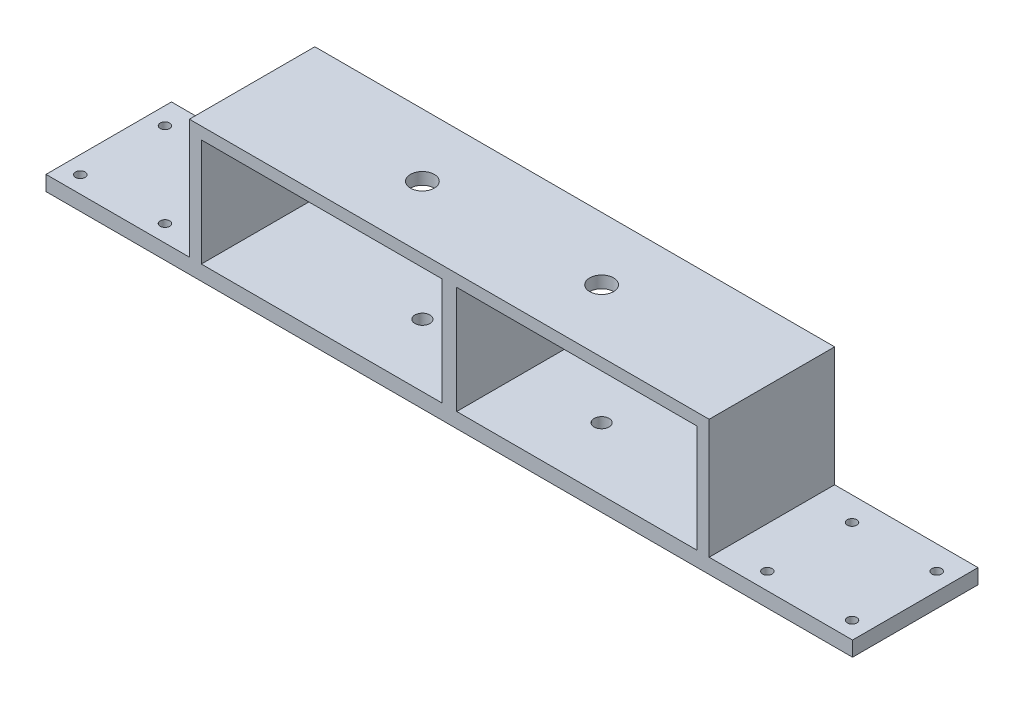
ISO-10303-21;
HEADER;
FILE_DESCRIPTION(('STEP AP214'),'2;1');
FILE_NAME('part.step','',(''),(''),'','','');
FILE_SCHEMA(('AUTOMOTIVE_DESIGN { 1 0 10303 214 1 1 1 1 }'));
ENDSEC;
DATA;
#1=APPLICATION_CONTEXT('core data for automotive mechanical design processes');
#2=APPLICATION_PROTOCOL_DEFINITION('international standard','automotive_design',2000,#1);
#3=PRODUCT_CONTEXT('',#1,'mechanical');
#4=PRODUCT('Part','Part','',(#3));
#5=PRODUCT_RELATED_PRODUCT_CATEGORY('part','',(#4));
#6=PRODUCT_DEFINITION_FORMATION('','',#4);
#7=PRODUCT_DEFINITION_CONTEXT('part definition',#1,'design');
#8=PRODUCT_DEFINITION('design','',#6,#7);
#9=PRODUCT_DEFINITION_SHAPE('','',#8);
#10=(LENGTH_UNIT() NAMED_UNIT(*) SI_UNIT(.MILLI.,.METRE.));
#11=(NAMED_UNIT(*) PLANE_ANGLE_UNIT() SI_UNIT($,.RADIAN.));
#12=(NAMED_UNIT(*) SI_UNIT($,.STERADIAN.) SOLID_ANGLE_UNIT());
#13=UNCERTAINTY_MEASURE_WITH_UNIT(LENGTH_MEASURE(1.E-05),#10,'distance_accuracy_value','');
#14=(GEOMETRIC_REPRESENTATION_CONTEXT(3) GLOBAL_UNCERTAINTY_ASSIGNED_CONTEXT((#13)) GLOBAL_UNIT_ASSIGNED_CONTEXT((#10,
#11,#12)) REPRESENTATION_CONTEXT('',''));
#15=CARTESIAN_POINT('',(0.,0.,0.));
#16=DIRECTION('',(0.,0.,1.));
#17=DIRECTION('',(1.,0.,0.));
#18=AXIS2_PLACEMENT_3D('',#15,#16,#17);
#19=CARTESIAN_POINT('',(0.,3.175,0.));
#20=DIRECTION('',(0.,1.,0.));
#21=DIRECTION('',(0.,0.,1.));
#22=AXIS2_PLACEMENT_3D('',#19,#20,#21);
#23=PLANE('',#22);
#24=CARTESIAN_POINT('',(-19.05,3.175,-13.335));
#25=DIRECTION('',(0.,1.,0.));
#26=DIRECTION('',(0.,0.,1.));
#27=AXIS2_PLACEMENT_3D('',#24,#25,#26);
#28=CIRCLE('',#27,1.5875);
#29=CARTESIAN_POINT('',(-19.05,3.175,-11.7475));
#30=VERTEX_POINT('',#29);
#31=EDGE_CURVE('E201',#30,#30,#28,.T.);
#32=ORIENTED_EDGE('',*,*,#31,.F.);
#33=EDGE_LOOP('',(#32));
#34=FACE_BOUND('',#33,.T.);
#35=DIRECTION('',(1.,0.,0.));
#36=VECTOR('',#35,1.);
#37=CARTESIAN_POINT('',(85.725,3.175,0.));
#38=LINE('',#37,#36);
#39=CARTESIAN_POINT('',(-52.705,3.175,0.));
#40=VERTEX_POINT('',#39);
#41=CARTESIAN_POINT('',(-1.58750000000001,3.175,0.));
#42=VERTEX_POINT('',#41);
#43=EDGE_CURVE('E62',#40,#42,#38,.T.);
#44=ORIENTED_EDGE('',*,*,#43,.T.);
#45=DIRECTION('',(0.,0.,1.));
#46=VECTOR('',#45,1.);
#47=CARTESIAN_POINT('',(-1.5875,3.175,0.));
#48=LINE('',#47,#46);
#49=CARTESIAN_POINT('',(-1.5875,3.175,-26.67));
#50=VERTEX_POINT('',#49);
#51=EDGE_CURVE('E166',#50,#42,#48,.T.);
#52=ORIENTED_EDGE('',*,*,#51,.F.);
#53=DIRECTION('',(-1.,0.,0.));
#54=VECTOR('',#53,1.);
#55=CARTESIAN_POINT('',(85.725,3.175,-26.67));
#56=LINE('',#55,#54);
#57=CARTESIAN_POINT('',(-52.705,3.175,-26.67));
#58=VERTEX_POINT('',#57);
#59=EDGE_CURVE('E152',#50,#58,#56,.T.);
#60=ORIENTED_EDGE('',*,*,#59,.T.);
#61=DIRECTION('',(0.,0.,-1.));
#62=VECTOR('',#61,1.);
#63=CARTESIAN_POINT('',(-52.705,3.175,0.));
#64=LINE('',#63,#62);
#65=EDGE_CURVE('E247',#40,#58,#64,.T.);
#66=ORIENTED_EDGE('',*,*,#65,.F.);
#67=EDGE_LOOP('',(#44,#52,#60,#66));
#68=FACE_BOUND('',#67,.T.);
#69=ADVANCED_FACE('F39',(#34,#68),#23,.T.);
#70=CARTESIAN_POINT('',(19.05,3.175,-13.335));
#71=DIRECTION('',(0.,1.,0.));
#72=DIRECTION('',(0.,0.,1.));
#73=AXIS2_PLACEMENT_3D('',#70,#71,#72);
#74=CIRCLE('',#73,1.5875);
#75=CARTESIAN_POINT('',(19.05,3.175,-11.7475));
#76=VERTEX_POINT('',#75);
#77=EDGE_CURVE('E195',#76,#76,#74,.T.);
#78=ORIENTED_EDGE('',*,*,#77,.F.);
#79=EDGE_LOOP('',(#78));
#80=FACE_BOUND('',#79,.T.);
#81=CARTESIAN_POINT('',(52.705,3.175,-26.67));
#82=VERTEX_POINT('',#81);
#83=CARTESIAN_POINT('',(1.58750000000001,3.175,-26.67));
#84=VERTEX_POINT('',#83);
#85=EDGE_CURVE('E161',#82,#84,#56,.T.);
#86=ORIENTED_EDGE('',*,*,#85,.T.);
#87=DIRECTION('',(0.,0.,-1.));
#88=VECTOR('',#87,1.);
#89=CARTESIAN_POINT('',(1.5875,3.175,0.));
#90=LINE('',#89,#88);
#91=CARTESIAN_POINT('',(1.58750000000001,3.175,0.));
#92=VERTEX_POINT('',#91);
#93=EDGE_CURVE('E54',#92,#84,#90,.T.);
#94=ORIENTED_EDGE('',*,*,#93,.F.);
#95=CARTESIAN_POINT('',(52.705,3.175,0.));
#96=VERTEX_POINT('',#95);
#97=EDGE_CURVE('E322',#92,#96,#38,.T.);
#98=ORIENTED_EDGE('',*,*,#97,.T.);
#99=DIRECTION('',(0.,0.,-1.));
#100=VECTOR('',#99,1.);
#101=CARTESIAN_POINT('',(52.705,3.175,0.));
#102=LINE('',#101,#100);
#103=EDGE_CURVE('E227',#96,#82,#102,.T.);
#104=ORIENTED_EDGE('',*,*,#103,.T.);
#105=EDGE_LOOP('',(#86,#94,#98,#104));
#106=FACE_BOUND('',#105,.T.);
#107=ADVANCED_FACE('F360',(#80,#106),#23,.T.);
#108=CARTESIAN_POINT('',(82.0356793493558,26.035,0.));
#109=DIRECTION('',(0.,-1.,0.));
#110=DIRECTION('',(0.,0.,-1.));
#111=AXIS2_PLACEMENT_3D('',#108,#109,#110);
#112=PLANE('',#111);
#113=CARTESIAN_POINT('',(-19.05,26.035,-13.335));
#114=DIRECTION('',(0.,-1.,0.));
#115=DIRECTION('',(0.,0.,-1.));
#116=AXIS2_PLACEMENT_3D('',#113,#114,#115);
#117=CIRCLE('',#116,2.54);
#118=CARTESIAN_POINT('',(-19.05,26.035,-15.875));
#119=VERTEX_POINT('',#118);
#120=EDGE_CURVE('E192',#119,#119,#117,.F.);
#121=ORIENTED_EDGE('',*,*,#120,.T.);
#122=EDGE_LOOP('',(#121));
#123=FACE_BOUND('',#122,.T.);
#124=DIRECTION('',(-1.,0.,0.));
#125=VECTOR('',#124,1.);
#126=CARTESIAN_POINT('',(82.0356793493558,26.035,-26.67));
#127=LINE('',#126,#125);
#128=CARTESIAN_POINT('',(-1.5875,26.035,-26.67));
#129=VERTEX_POINT('',#128);
#130=CARTESIAN_POINT('',(-52.705,26.035,-26.67));
#131=VERTEX_POINT('',#130);
#132=EDGE_CURVE('E222',#129,#131,#127,.T.);
#133=ORIENTED_EDGE('',*,*,#132,.F.);
#134=DIRECTION('',(0.,0.,-1.));
#135=VECTOR('',#134,1.);
#136=CARTESIAN_POINT('',(-1.5875,26.035,0.));
#137=LINE('',#136,#135);
#138=CARTESIAN_POINT('',(-1.5875,26.035,0.));
#139=VERTEX_POINT('',#138);
#140=EDGE_CURVE('E172',#139,#129,#137,.T.);
#141=ORIENTED_EDGE('',*,*,#140,.F.);
#142=DIRECTION('',(-1.,0.,0.));
#143=VECTOR('',#142,1.);
#144=CARTESIAN_POINT('',(82.0356793493558,26.035,0.));
#145=LINE('',#144,#143);
#146=CARTESIAN_POINT('',(-52.705,26.035,0.));
#147=VERTEX_POINT('',#146);
#148=EDGE_CURVE('E218',#139,#147,#145,.T.);
#149=ORIENTED_EDGE('',*,*,#148,.T.);
#150=DIRECTION('',(0.,0.,-1.));
#151=VECTOR('',#150,1.);
#152=CARTESIAN_POINT('',(-52.705,26.035,0.));
#153=LINE('',#152,#151);
#154=EDGE_CURVE('E248',#147,#131,#153,.T.);
#155=ORIENTED_EDGE('',*,*,#154,.T.);
#156=EDGE_LOOP('',(#133,#141,#149,#155));
#157=FACE_BOUND('',#156,.T.);
#158=ADVANCED_FACE('F400',(#123,#157),#112,.T.);
#159=CARTESIAN_POINT('',(19.05,26.035,-13.335));
#160=DIRECTION('',(0.,-1.,0.));
#161=DIRECTION('',(0.,0.,-1.));
#162=AXIS2_PLACEMENT_3D('',#159,#160,#161);
#163=CIRCLE('',#162,2.54);
#164=CARTESIAN_POINT('',(19.05,26.035,-15.875));
#165=VERTEX_POINT('',#164);
#166=EDGE_CURVE('E185',#165,#165,#163,.F.);
#167=ORIENTED_EDGE('',*,*,#166,.T.);
#168=EDGE_LOOP('',(#167));
#169=FACE_BOUND('',#168,.T.);
#170=CARTESIAN_POINT('',(52.705,26.035,0.));
#171=VERTEX_POINT('',#170);
#172=CARTESIAN_POINT('',(1.5875,26.035,0.));
#173=VERTEX_POINT('',#172);
#174=EDGE_CURVE('E214',#171,#173,#145,.T.);
#175=ORIENTED_EDGE('',*,*,#174,.T.);
#176=DIRECTION('',(0.,0.,1.));
#177=VECTOR('',#176,1.);
#178=CARTESIAN_POINT('',(1.5875,26.035,0.));
#179=LINE('',#178,#177);
#180=CARTESIAN_POINT('',(1.58750000000001,26.035,-26.67));
#181=VERTEX_POINT('',#180);
#182=EDGE_CURVE('E186',#181,#173,#179,.T.);
#183=ORIENTED_EDGE('',*,*,#182,.F.);
#184=CARTESIAN_POINT('',(52.705,26.035,-26.67));
#185=VERTEX_POINT('',#184);
#186=EDGE_CURVE('E219',#185,#181,#127,.T.);
#187=ORIENTED_EDGE('',*,*,#186,.F.);
#188=DIRECTION('',(0.,0.,-1.));
#189=VECTOR('',#188,1.);
#190=CARTESIAN_POINT('',(52.705,26.035,0.));
#191=LINE('',#190,#189);
#192=EDGE_CURVE('E228',#171,#185,#191,.T.);
#193=ORIENTED_EDGE('',*,*,#192,.F.);
#194=EDGE_LOOP('',(#175,#183,#187,#193));
#195=FACE_BOUND('',#194,.T.);
#196=ADVANCED_FACE('F376',(#169,#195),#112,.T.);
#197=DIRECTION('',(0.,0.,1.));
#198=VECTOR('',#197,1.);
#199=CARTESIAN_POINT('',(55.245,3.175,0.));
#200=LINE('',#199,#198);
#201=CARTESIAN_POINT('',(55.245,3.175,-26.67));
#202=VERTEX_POINT('',#201);
#203=CARTESIAN_POINT('',(55.245,3.175,0.));
#204=VERTEX_POINT('',#203);
#205=EDGE_CURVE('E232',#202,#204,#200,.T.);
#206=ORIENTED_EDGE('',*,*,#205,.T.);
#207=CARTESIAN_POINT('',(85.725,3.175,0.));
#208=VERTEX_POINT('',#207);
#209=EDGE_CURVE('E317',#204,#208,#38,.T.);
#210=ORIENTED_EDGE('',*,*,#209,.T.);
#211=DIRECTION('',(0.,0.,-1.));
#212=VECTOR('',#211,1.);
#213=CARTESIAN_POINT('',(85.725,3.175,0.));
#214=LINE('',#213,#212);
#215=CARTESIAN_POINT('',(85.725,3.175,-26.67));
#216=VERTEX_POINT('',#215);
#217=EDGE_CURVE('E321',#208,#216,#214,.T.);
#218=ORIENTED_EDGE('',*,*,#217,.T.);
#219=EDGE_CURVE('E164',#216,#202,#56,.T.);
#220=ORIENTED_EDGE('',*,*,#219,.T.);
#221=EDGE_LOOP('',(#206,#210,#218,#220));
#222=FACE_BOUND('',#221,.T.);
#223=CARTESIAN_POINT('',(82.025,3.175,-3.59000000000002));
#224=DIRECTION('',(0.,1.,0.));
#225=DIRECTION('',(0.,0.,1.));
#226=AXIS2_PLACEMENT_3D('',#223,#224,#225);
#227=CIRCLE('',#226,1.016);
#228=CARTESIAN_POINT('',(82.025,3.175,-2.57400000000002));
#229=VERTEX_POINT('',#228);
#230=EDGE_CURVE('E290',#229,#229,#227,.T.);
#231=ORIENTED_EDGE('',*,*,#230,.F.);
#232=EDGE_LOOP('',(#231));
#233=FACE_BOUND('',#232,.T.);
#234=CARTESIAN_POINT('',(82.025,3.175,-21.59));
#235=DIRECTION('',(0.,1.,0.));
#236=DIRECTION('',(0.,0.,1.));
#237=AXIS2_PLACEMENT_3D('',#234,#235,#236);
#238=CIRCLE('',#237,1.016);
#239=CARTESIAN_POINT('',(82.025,3.175,-20.574));
#240=VERTEX_POINT('',#239);
#241=EDGE_CURVE('E302',#240,#240,#238,.T.);
#242=ORIENTED_EDGE('',*,*,#241,.F.);
#243=EDGE_LOOP('',(#242));
#244=FACE_BOUND('',#243,.T.);
#245=CARTESIAN_POINT('',(64.025,3.175,-21.59));
#246=DIRECTION('',(0.,1.,0.));
#247=DIRECTION('',(0.,0.,1.));
#248=AXIS2_PLACEMENT_3D('',#245,#246,#247);
#249=CIRCLE('',#248,1.016);
#250=CARTESIAN_POINT('',(64.025,3.175,-20.574));
#251=VERTEX_POINT('',#250);
#252=EDGE_CURVE('E308',#251,#251,#249,.T.);
#253=ORIENTED_EDGE('',*,*,#252,.F.);
#254=EDGE_LOOP('',(#253));
#255=FACE_BOUND('',#254,.T.);
#256=CARTESIAN_POINT('',(64.025,3.175,-3.59000000000002));
#257=DIRECTION('',(0.,1.,0.));
#258=DIRECTION('',(0.,0.,1.));
#259=AXIS2_PLACEMENT_3D('',#256,#257,#258);
#260=CIRCLE('',#259,1.016);
#261=CARTESIAN_POINT('',(64.025,3.175,-2.57400000000002));
#262=VERTEX_POINT('',#261);
#263=EDGE_CURVE('E296',#262,#262,#260,.T.);
#264=ORIENTED_EDGE('',*,*,#263,.F.);
#265=EDGE_LOOP('',(#264));
#266=FACE_BOUND('',#265,.T.);
#267=ADVANCED_FACE('F402',(#222,#233,#244,#255,#266),#23,.T.);
#268=DIRECTION('',(0.,0.,1.));
#269=VECTOR('',#268,1.);
#270=CARTESIAN_POINT('',(-55.245,3.175,0.));
#271=LINE('',#270,#269);
#272=CARTESIAN_POINT('',(-55.245,3.175,-26.67));
#273=VERTEX_POINT('',#272);
#274=CARTESIAN_POINT('',(-55.245,3.175,0.));
#275=VERTEX_POINT('',#274);
#276=EDGE_CURVE('E252',#273,#275,#271,.T.);
#277=ORIENTED_EDGE('',*,*,#276,.F.);
#278=CARTESIAN_POINT('',(-85.725,3.175,-26.67));
#279=VERTEX_POINT('',#278);
#280=EDGE_CURVE('E162',#273,#279,#56,.T.);
#281=ORIENTED_EDGE('',*,*,#280,.T.);
#282=DIRECTION('',(0.,0.,1.));
#283=VECTOR('',#282,1.);
#284=CARTESIAN_POINT('',(-85.725,3.175,0.));
#285=LINE('',#284,#283);
#286=CARTESIAN_POINT('',(-85.725,3.175,0.));
#287=VERTEX_POINT('',#286);
#288=EDGE_CURVE('E314',#279,#287,#285,.T.);
#289=ORIENTED_EDGE('',*,*,#288,.T.);
#290=EDGE_CURVE('E319',#287,#275,#38,.T.);
#291=ORIENTED_EDGE('',*,*,#290,.T.);
#292=EDGE_LOOP('',(#277,#281,#289,#291));
#293=FACE_BOUND('',#292,.T.);
#294=CARTESIAN_POINT('',(-82.025,3.175,-21.59));
#295=DIRECTION('',(0.,1.,0.));
#296=DIRECTION('',(0.,0.,-1.));
#297=AXIS2_PLACEMENT_3D('',#294,#295,#296);
#298=CIRCLE('',#297,1.016);
#299=CARTESIAN_POINT('',(-82.025,3.175,-22.606));
#300=VERTEX_POINT('',#299);
#301=EDGE_CURVE('E272',#300,#300,#298,.T.);
#302=ORIENTED_EDGE('',*,*,#301,.F.);
#303=EDGE_LOOP('',(#302));
#304=FACE_BOUND('',#303,.T.);
#305=CARTESIAN_POINT('',(-82.025,3.175,-3.59));
#306=DIRECTION('',(0.,1.,0.));
#307=DIRECTION('',(0.,0.,-1.));
#308=AXIS2_PLACEMENT_3D('',#305,#306,#307);
#309=CIRCLE('',#308,1.016);
#310=CARTESIAN_POINT('',(-82.025,3.175,-4.606));
#311=VERTEX_POINT('',#310);
#312=EDGE_CURVE('E284',#311,#311,#309,.T.);
#313=ORIENTED_EDGE('',*,*,#312,.F.);
#314=EDGE_LOOP('',(#313));
#315=FACE_BOUND('',#314,.T.);
#316=CARTESIAN_POINT('',(-64.025,3.175,-3.59));
#317=DIRECTION('',(0.,1.,0.));
#318=DIRECTION('',(0.,0.,-1.));
#319=AXIS2_PLACEMENT_3D('',#316,#317,#318);
#320=CIRCLE('',#319,1.016);
#321=CARTESIAN_POINT('',(-64.025,3.175,-4.60600000000001));
#322=VERTEX_POINT('',#321);
#323=EDGE_CURVE('E278',#322,#322,#320,.T.);
#324=ORIENTED_EDGE('',*,*,#323,.F.);
#325=EDGE_LOOP('',(#324));
#326=FACE_BOUND('',#325,.T.);
#327=CARTESIAN_POINT('',(-64.025,3.175,-21.59));
#328=DIRECTION('',(0.,1.,0.));
#329=DIRECTION('',(0.,0.,-1.));
#330=AXIS2_PLACEMENT_3D('',#327,#328,#329);
#331=CIRCLE('',#330,1.016);
#332=CARTESIAN_POINT('',(-64.025,3.175,-22.606));
#333=VERTEX_POINT('',#332);
#334=EDGE_CURVE('E266',#333,#333,#331,.T.);
#335=ORIENTED_EDGE('',*,*,#334,.F.);
#336=EDGE_LOOP('',(#335));
#337=FACE_BOUND('',#336,.T.);
#338=ADVANCED_FACE('F358',(#293,#304,#315,#326,#337),#23,.T.);
#339=CARTESIAN_POINT('',(0.,0.,0.));
#340=DIRECTION('',(0.,1.,0.));
#341=DIRECTION('',(0.,0.,1.));
#342=AXIS2_PLACEMENT_3D('',#339,#340,#341);
#343=PLANE('',#342);
#344=CARTESIAN_POINT('',(19.05,0.,-13.335));
#345=DIRECTION('',(0.,1.,0.));
#346=DIRECTION('',(0.,0.,1.));
#347=AXIS2_PLACEMENT_3D('',#344,#345,#346);
#348=CIRCLE('',#347,1.5875);
#349=CARTESIAN_POINT('',(19.05,0.,-11.7475));
#350=VERTEX_POINT('',#349);
#351=EDGE_CURVE('E198',#350,#350,#348,.F.);
#352=ORIENTED_EDGE('',*,*,#351,.F.);
#353=EDGE_LOOP('',(#352));
#354=FACE_BOUND('',#353,.T.);
#355=CARTESIAN_POINT('',(-19.05,0.,-13.335));
#356=DIRECTION('',(0.,1.,0.));
#357=DIRECTION('',(0.,0.,1.));
#358=AXIS2_PLACEMENT_3D('',#355,#356,#357);
#359=CIRCLE('',#358,1.5875);
#360=CARTESIAN_POINT('',(-19.05,0.,-11.7475));
#361=VERTEX_POINT('',#360);
#362=EDGE_CURVE('E204',#361,#361,#359,.F.);
#363=ORIENTED_EDGE('',*,*,#362,.F.);
#364=EDGE_LOOP('',(#363));
#365=FACE_BOUND('',#364,.T.);
#366=DIRECTION('',(0.,0.,1.));
#367=VECTOR('',#366,1.);
#368=CARTESIAN_POINT('',(-85.725,0.,0.));
#369=LINE('',#368,#367);
#370=CARTESIAN_POINT('',(-85.725,0.,-26.67));
#371=VERTEX_POINT('',#370);
#372=CARTESIAN_POINT('',(-85.725,0.,0.));
#373=VERTEX_POINT('',#372);
#374=EDGE_CURVE('E311',#371,#373,#369,.T.);
#375=ORIENTED_EDGE('',*,*,#374,.F.);
#376=DIRECTION('',(-1.,0.,0.));
#377=VECTOR('',#376,1.);
#378=CARTESIAN_POINT('',(85.725,0.,-26.67));
#379=LINE('',#378,#377);
#380=CARTESIAN_POINT('',(85.725,0.,-26.67));
#381=VERTEX_POINT('',#380);
#382=EDGE_CURVE('E318',#381,#371,#379,.T.);
#383=ORIENTED_EDGE('',*,*,#382,.F.);
#384=DIRECTION('',(0.,0.,-1.));
#385=VECTOR('',#384,1.);
#386=CARTESIAN_POINT('',(85.725,0.,0.));
#387=LINE('',#386,#385);
#388=CARTESIAN_POINT('',(85.725,0.,0.));
#389=VERTEX_POINT('',#388);
#390=EDGE_CURVE('E329',#389,#381,#387,.T.);
#391=ORIENTED_EDGE('',*,*,#390,.F.);
#392=DIRECTION('',(1.,0.,0.));
#393=VECTOR('',#392,1.);
#394=CARTESIAN_POINT('',(85.725,0.,0.));
#395=LINE('',#394,#393);
#396=EDGE_CURVE('E327',#373,#389,#395,.T.);
#397=ORIENTED_EDGE('',*,*,#396,.F.);
#398=EDGE_LOOP('',(#375,#383,#391,#397));
#399=FACE_BOUND('',#398,.T.);
#400=CARTESIAN_POINT('',(64.025,0.,-21.59));
#401=DIRECTION('',(0.,1.,0.));
#402=DIRECTION('',(0.,0.,1.));
#403=AXIS2_PLACEMENT_3D('',#400,#401,#402);
#404=CIRCLE('',#403,1.016);
#405=CARTESIAN_POINT('',(64.025,0.,-20.574));
#406=VERTEX_POINT('',#405);
#407=EDGE_CURVE('E305',#406,#406,#404,.T.);
#408=ORIENTED_EDGE('',*,*,#407,.T.);
#409=EDGE_LOOP('',(#408));
#410=FACE_BOUND('',#409,.T.);
#411=CARTESIAN_POINT('',(82.025,0.,-21.59));
#412=DIRECTION('',(0.,1.,0.));
#413=DIRECTION('',(0.,0.,1.));
#414=AXIS2_PLACEMENT_3D('',#411,#412,#413);
#415=CIRCLE('',#414,1.016);
#416=CARTESIAN_POINT('',(82.025,0.,-20.574));
#417=VERTEX_POINT('',#416);
#418=EDGE_CURVE('E299',#417,#417,#415,.T.);
#419=ORIENTED_EDGE('',*,*,#418,.T.);
#420=EDGE_LOOP('',(#419));
#421=FACE_BOUND('',#420,.T.);
#422=CARTESIAN_POINT('',(64.025,0.,-3.59000000000002));
#423=DIRECTION('',(0.,1.,0.));
#424=DIRECTION('',(0.,0.,1.));
#425=AXIS2_PLACEMENT_3D('',#422,#423,#424);
#426=CIRCLE('',#425,1.016);
#427=CARTESIAN_POINT('',(64.025,0.,-2.57400000000002));
#428=VERTEX_POINT('',#427);
#429=EDGE_CURVE('E293',#428,#428,#426,.T.);
#430=ORIENTED_EDGE('',*,*,#429,.T.);
#431=EDGE_LOOP('',(#430));
#432=FACE_BOUND('',#431,.T.);
#433=CARTESIAN_POINT('',(82.025,0.,-3.59000000000002));
#434=DIRECTION('',(0.,1.,0.));
#435=DIRECTION('',(0.,0.,1.));
#436=AXIS2_PLACEMENT_3D('',#433,#434,#435);
#437=CIRCLE('',#436,1.016);
#438=CARTESIAN_POINT('',(82.025,0.,-2.57400000000002));
#439=VERTEX_POINT('',#438);
#440=EDGE_CURVE('E287',#439,#439,#437,.T.);
#441=ORIENTED_EDGE('',*,*,#440,.T.);
#442=EDGE_LOOP('',(#441));
#443=FACE_BOUND('',#442,.T.);
#444=CARTESIAN_POINT('',(-82.025,0.,-3.59));
#445=DIRECTION('',(0.,1.,0.));
#446=DIRECTION('',(0.,0.,-1.));
#447=AXIS2_PLACEMENT_3D('',#444,#445,#446);
#448=CIRCLE('',#447,1.016);
#449=CARTESIAN_POINT('',(-82.025,0.,-4.606));
#450=VERTEX_POINT('',#449);
#451=EDGE_CURVE('E281',#450,#450,#448,.T.);
#452=ORIENTED_EDGE('',*,*,#451,.T.);
#453=EDGE_LOOP('',(#452));
#454=FACE_BOUND('',#453,.T.);
#455=CARTESIAN_POINT('',(-64.025,0.,-3.59));
#456=DIRECTION('',(0.,1.,0.));
#457=DIRECTION('',(0.,0.,-1.));
#458=AXIS2_PLACEMENT_3D('',#455,#456,#457);
#459=CIRCLE('',#458,1.016);
#460=CARTESIAN_POINT('',(-64.025,0.,-4.60600000000001));
#461=VERTEX_POINT('',#460);
#462=EDGE_CURVE('E275',#461,#461,#459,.T.);
#463=ORIENTED_EDGE('',*,*,#462,.T.);
#464=EDGE_LOOP('',(#463));
#465=FACE_BOUND('',#464,.T.);
#466=CARTESIAN_POINT('',(-82.025,0.,-21.59));
#467=DIRECTION('',(0.,1.,0.));
#468=DIRECTION('',(0.,0.,-1.));
#469=AXIS2_PLACEMENT_3D('',#466,#467,#468);
#470=CIRCLE('',#469,1.016);
#471=CARTESIAN_POINT('',(-82.025,0.,-22.606));
#472=VERTEX_POINT('',#471);
#473=EDGE_CURVE('E269',#472,#472,#470,.T.);
#474=ORIENTED_EDGE('',*,*,#473,.T.);
#475=EDGE_LOOP('',(#474));
#476=FACE_BOUND('',#475,.T.);
#477=CARTESIAN_POINT('',(-64.025,0.,-21.59));
#478=DIRECTION('',(0.,1.,0.));
#479=DIRECTION('',(0.,0.,-1.));
#480=AXIS2_PLACEMENT_3D('',#477,#478,#479);
#481=CIRCLE('',#480,1.016);
#482=CARTESIAN_POINT('',(-64.025,0.,-22.606));
#483=VERTEX_POINT('',#482);
#484=EDGE_CURVE('E265',#483,#483,#481,.T.);
#485=ORIENTED_EDGE('',*,*,#484,.T.);
#486=EDGE_LOOP('',(#485));
#487=FACE_BOUND('',#486,.T.);
#488=ADVANCED_FACE('F348',(#354,#365,#399,#410,#421,#432,#443,#454,#465,#476,#487),#343,.F.);
#489=CARTESIAN_POINT('',(-85.725,3.175,0.));
#490=DIRECTION('',(1.,0.,0.));
#491=DIRECTION('',(0.,0.,-1.));
#492=AXIS2_PLACEMENT_3D('',#489,#490,#491);
#493=PLANE('',#492);
#494=ORIENTED_EDGE('',*,*,#374,.T.);
#495=DIRECTION('',(0.,-1.,0.));
#496=VECTOR('',#495,1.);
#497=CARTESIAN_POINT('',(-85.725,3.175,0.));
#498=LINE('',#497,#496);
#499=EDGE_CURVE('E11',#287,#373,#498,.T.);
#500=ORIENTED_EDGE('',*,*,#499,.F.);
#501=ORIENTED_EDGE('',*,*,#288,.F.);
#502=DIRECTION('',(0.,-1.,0.));
#503=VECTOR('',#502,1.);
#504=CARTESIAN_POINT('',(-85.725,3.175,-26.67));
#505=LINE('',#504,#503);
#506=EDGE_CURVE('E324',#279,#371,#505,.T.);
#507=ORIENTED_EDGE('',*,*,#506,.T.);
#508=EDGE_LOOP('',(#494,#500,#501,#507));
#509=FACE_BOUND('',#508,.T.);
#510=ADVANCED_FACE('F41',(#509),#493,.F.);
#511=CARTESIAN_POINT('',(85.725,3.175,0.));
#512=DIRECTION('',(0.,0.,-1.));
#513=DIRECTION('',(-1.,0.,0.));
#514=AXIS2_PLACEMENT_3D('',#511,#512,#513);
#515=PLANE('',#514);
#516=ORIENTED_EDGE('',*,*,#97,.F.);
#517=DIRECTION('',(0.,-1.,0.));
#518=VECTOR('',#517,1.);
#519=CARTESIAN_POINT('',(1.5875,52.8933231978469,0.));
#520=LINE('',#519,#518);
#521=EDGE_CURVE('E168',#173,#92,#520,.T.);
#522=ORIENTED_EDGE('',*,*,#521,.F.);
#523=ORIENTED_EDGE('',*,*,#174,.F.);
#524=DIRECTION('',(0.,-1.,0.));
#525=VECTOR('',#524,1.);
#526=CARTESIAN_POINT('',(52.705,26.035,0.));
#527=LINE('',#526,#525);
#528=EDGE_CURVE('E244',#171,#96,#527,.T.);
#529=ORIENTED_EDGE('',*,*,#528,.T.);
#530=EDGE_LOOP('',(#516,#522,#523,#529));
#531=FACE_BOUND('',#530,.T.);
#532=DIRECTION('',(0.,-1.,0.));
#533=VECTOR('',#532,1.);
#534=CARTESIAN_POINT('',(-52.705,26.035,0.));
#535=LINE('',#534,#533);
#536=EDGE_CURVE('E251',#147,#40,#535,.T.);
#537=ORIENTED_EDGE('',*,*,#536,.F.);
#538=ORIENTED_EDGE('',*,*,#148,.F.);
#539=DIRECTION('',(0.,-1.,0.));
#540=VECTOR('',#539,1.);
#541=CARTESIAN_POINT('',(-1.5875,52.8933231978469,0.));
#542=LINE('',#541,#540);
#543=EDGE_CURVE('E175',#139,#42,#542,.T.);
#544=ORIENTED_EDGE('',*,*,#543,.T.);
#545=ORIENTED_EDGE('',*,*,#43,.F.);
#546=EDGE_LOOP('',(#537,#538,#544,#545));
#547=FACE_BOUND('',#546,.T.);
#548=ORIENTED_EDGE('',*,*,#396,.T.);
#549=DIRECTION('',(0.,-1.,0.));
#550=VECTOR('',#549,1.);
#551=CARTESIAN_POINT('',(85.725,3.175,0.));
#552=LINE('',#551,#550);
#553=EDGE_CURVE('E47',#208,#389,#552,.T.);
#554=ORIENTED_EDGE('',*,*,#553,.F.);
#555=ORIENTED_EDGE('',*,*,#209,.F.);
#556=DIRECTION('',(0.,-1.,0.));
#557=VECTOR('',#556,1.);
#558=CARTESIAN_POINT('',(55.245,26.035,0.));
#559=LINE('',#558,#557);
#560=CARTESIAN_POINT('',(55.245,28.575,0.));
#561=VERTEX_POINT('',#560);
#562=EDGE_CURVE('E241',#561,#204,#559,.T.);
#563=ORIENTED_EDGE('',*,*,#562,.F.);
#564=DIRECTION('',(-1.,0.,0.));
#565=VECTOR('',#564,1.);
#566=CARTESIAN_POINT('',(82.0356793493558,28.575,0.));
#567=LINE('',#566,#565);
#568=CARTESIAN_POINT('',(-55.245,28.575,0.));
#569=VERTEX_POINT('',#568);
#570=EDGE_CURVE('E217',#561,#569,#567,.T.);
#571=ORIENTED_EDGE('',*,*,#570,.T.);
#572=DIRECTION('',(0.,-1.,0.));
#573=VECTOR('',#572,1.);
#574=CARTESIAN_POINT('',(-55.245,26.035,0.));
#575=LINE('',#574,#573);
#576=EDGE_CURVE('E258',#569,#275,#575,.T.);
#577=ORIENTED_EDGE('',*,*,#576,.T.);
#578=ORIENTED_EDGE('',*,*,#290,.F.);
#579=ORIENTED_EDGE('',*,*,#499,.T.);
#580=EDGE_LOOP('',(#548,#554,#555,#563,#571,#577,#578,#579));
#581=FACE_BOUND('',#580,.T.);
#582=ADVANCED_FACE('F373',(#531,#547,#581),#515,.F.);
#583=CARTESIAN_POINT('',(85.725,3.175,0.));
#584=DIRECTION('',(-1.,0.,0.));
#585=DIRECTION('',(0.,0.,1.));
#586=AXIS2_PLACEMENT_3D('',#583,#584,#585);
#587=PLANE('',#586);
#588=ORIENTED_EDGE('',*,*,#390,.T.);
#589=DIRECTION('',(0.,-1.,0.));
#590=VECTOR('',#589,1.);
#591=CARTESIAN_POINT('',(85.725,3.175,-26.67));
#592=LINE('',#591,#590);
#593=EDGE_CURVE('E334',#216,#381,#592,.T.);
#594=ORIENTED_EDGE('',*,*,#593,.F.);
#595=ORIENTED_EDGE('',*,*,#217,.F.);
#596=ORIENTED_EDGE('',*,*,#553,.T.);
#597=EDGE_LOOP('',(#588,#594,#595,#596));
#598=FACE_BOUND('',#597,.T.);
#599=ADVANCED_FACE('F341',(#598),#587,.F.);
#600=CARTESIAN_POINT('',(85.725,3.175,-26.67));
#601=DIRECTION('',(0.,0.,1.));
#602=DIRECTION('',(1.,0.,0.));
#603=AXIS2_PLACEMENT_3D('',#600,#601,#602);
#604=PLANE('',#603);
#605=ORIENTED_EDGE('',*,*,#59,.F.);
#606=DIRECTION('',(0.,-1.,0.));
#607=VECTOR('',#606,1.);
#608=CARTESIAN_POINT('',(-1.5875,52.8933231978469,-26.67));
#609=LINE('',#608,#607);
#610=EDGE_CURVE('E156',#129,#50,#609,.T.);
#611=ORIENTED_EDGE('',*,*,#610,.F.);
#612=ORIENTED_EDGE('',*,*,#132,.T.);
#613=DIRECTION('',(0.,-1.,0.));
#614=VECTOR('',#613,1.);
#615=CARTESIAN_POINT('',(-52.705,26.035,-26.67));
#616=LINE('',#615,#614);
#617=EDGE_CURVE('E159',#131,#58,#616,.T.);
#618=ORIENTED_EDGE('',*,*,#617,.T.);
#619=EDGE_LOOP('',(#605,#611,#612,#618));
#620=FACE_BOUND('',#619,.T.);
#621=DIRECTION('',(0.,-1.,0.));
#622=VECTOR('',#621,1.);
#623=CARTESIAN_POINT('',(-55.245,26.035,-26.67));
#624=LINE('',#623,#622);
#625=CARTESIAN_POINT('',(-55.245,28.575,-26.67));
#626=VERTEX_POINT('',#625);
#627=EDGE_CURVE('E261',#626,#273,#624,.T.);
#628=ORIENTED_EDGE('',*,*,#627,.F.);
#629=DIRECTION('',(-1.,0.,0.));
#630=VECTOR('',#629,1.);
#631=CARTESIAN_POINT('',(82.0356793493558,28.575,-26.67));
#632=LINE('',#631,#630);
#633=CARTESIAN_POINT('',(55.245,28.575,-26.67));
#634=VERTEX_POINT('',#633);
#635=EDGE_CURVE('E213',#634,#626,#632,.T.);
#636=ORIENTED_EDGE('',*,*,#635,.F.);
#637=DIRECTION('',(0.,-1.,0.));
#638=VECTOR('',#637,1.);
#639=CARTESIAN_POINT('',(55.245,26.035,-26.67));
#640=LINE('',#639,#638);
#641=EDGE_CURVE('E238',#634,#202,#640,.T.);
#642=ORIENTED_EDGE('',*,*,#641,.T.);
#643=ORIENTED_EDGE('',*,*,#219,.F.);
#644=ORIENTED_EDGE('',*,*,#593,.T.);
#645=ORIENTED_EDGE('',*,*,#382,.T.);
#646=ORIENTED_EDGE('',*,*,#506,.F.);
#647=ORIENTED_EDGE('',*,*,#280,.F.);
#648=EDGE_LOOP('',(#628,#636,#642,#643,#644,#645,#646,#647));
#649=FACE_BOUND('',#648,.T.);
#650=ORIENTED_EDGE('',*,*,#186,.T.);
#651=DIRECTION('',(0.,-1.,0.));
#652=VECTOR('',#651,1.);
#653=CARTESIAN_POINT('',(1.5875,52.8933231978469,-26.67));
#654=LINE('',#653,#652);
#655=EDGE_CURVE('E174',#181,#84,#654,.T.);
#656=ORIENTED_EDGE('',*,*,#655,.T.);
#657=ORIENTED_EDGE('',*,*,#85,.F.);
#658=DIRECTION('',(0.,-1.,0.));
#659=VECTOR('',#658,1.);
#660=CARTESIAN_POINT('',(52.705,26.035,-26.67));
#661=LINE('',#660,#659);
#662=EDGE_CURVE('E231',#185,#82,#661,.T.);
#663=ORIENTED_EDGE('',*,*,#662,.F.);
#664=EDGE_LOOP('',(#650,#656,#657,#663));
#665=FACE_BOUND('',#664,.T.);
#666=ADVANCED_FACE('F153',(#620,#649,#665),#604,.F.);
#667=CARTESIAN_POINT('',(64.025,3.175,-21.59));
#668=DIRECTION('',(0.,-1.,0.));
#669=DIRECTION('',(0.,0.,-1.));
#670=AXIS2_PLACEMENT_3D('',#667,#668,#669);
#671=CYLINDRICAL_SURFACE('',#670,1.016);
#672=ORIENTED_EDGE('',*,*,#252,.T.);
#673=EDGE_LOOP('',(#672));
#674=FACE_BOUND('',#673,.T.);
#675=ORIENTED_EDGE('',*,*,#407,.F.);
#676=EDGE_LOOP('',(#675));
#677=FACE_BOUND('',#676,.T.);
#678=ADVANCED_FACE('F473',(#674,#677),#671,.F.);
#679=CARTESIAN_POINT('',(82.025,3.175,-21.59));
#680=DIRECTION('',(0.,-1.,0.));
#681=DIRECTION('',(0.,0.,-1.));
#682=AXIS2_PLACEMENT_3D('',#679,#680,#681);
#683=CYLINDRICAL_SURFACE('',#682,1.016);
#684=ORIENTED_EDGE('',*,*,#241,.T.);
#685=EDGE_LOOP('',(#684));
#686=FACE_BOUND('',#685,.T.);
#687=ORIENTED_EDGE('',*,*,#418,.F.);
#688=EDGE_LOOP('',(#687));
#689=FACE_BOUND('',#688,.T.);
#690=ADVANCED_FACE('F432',(#686,#689),#683,.F.);
#691=CARTESIAN_POINT('',(64.025,3.175,-3.59000000000002));
#692=DIRECTION('',(0.,-1.,0.));
#693=DIRECTION('',(0.,0.,-1.));
#694=AXIS2_PLACEMENT_3D('',#691,#692,#693);
#695=CYLINDRICAL_SURFACE('',#694,1.016);
#696=ORIENTED_EDGE('',*,*,#263,.T.);
#697=EDGE_LOOP('',(#696));
#698=FACE_BOUND('',#697,.T.);
#699=ORIENTED_EDGE('',*,*,#429,.F.);
#700=EDGE_LOOP('',(#699));
#701=FACE_BOUND('',#700,.T.);
#702=ADVANCED_FACE('F428',(#698,#701),#695,.F.);
#703=CARTESIAN_POINT('',(82.025,3.175,-3.59000000000002));
#704=DIRECTION('',(0.,-1.,0.));
#705=DIRECTION('',(0.,0.,-1.));
#706=AXIS2_PLACEMENT_3D('',#703,#704,#705);
#707=CYLINDRICAL_SURFACE('',#706,1.016);
#708=ORIENTED_EDGE('',*,*,#230,.T.);
#709=EDGE_LOOP('',(#708));
#710=FACE_BOUND('',#709,.T.);
#711=ORIENTED_EDGE('',*,*,#440,.F.);
#712=EDGE_LOOP('',(#711));
#713=FACE_BOUND('',#712,.T.);
#714=ADVANCED_FACE('F431',(#710,#713),#707,.F.);
#715=CARTESIAN_POINT('',(-82.025,3.175,-3.59));
#716=DIRECTION('',(0.,-1.,0.));
#717=DIRECTION('',(0.,0.,-1.));
#718=AXIS2_PLACEMENT_3D('',#715,#716,#717);
#719=CYLINDRICAL_SURFACE('',#718,1.016);
#720=ORIENTED_EDGE('',*,*,#312,.T.);
#721=EDGE_LOOP('',(#720));
#722=FACE_BOUND('',#721,.T.);
#723=ORIENTED_EDGE('',*,*,#451,.F.);
#724=EDGE_LOOP('',(#723));
#725=FACE_BOUND('',#724,.T.);
#726=ADVANCED_FACE('F464',(#722,#725),#719,.F.);
#727=CARTESIAN_POINT('',(-64.025,3.175,-3.59));
#728=DIRECTION('',(0.,-1.,0.));
#729=DIRECTION('',(0.,0.,-1.));
#730=AXIS2_PLACEMENT_3D('',#727,#728,#729);
#731=CYLINDRICAL_SURFACE('',#730,1.016);
#732=ORIENTED_EDGE('',*,*,#323,.T.);
#733=EDGE_LOOP('',(#732));
#734=FACE_BOUND('',#733,.T.);
#735=ORIENTED_EDGE('',*,*,#462,.F.);
#736=EDGE_LOOP('',(#735));
#737=FACE_BOUND('',#736,.T.);
#738=ADVANCED_FACE('F458',(#734,#737),#731,.F.);
#739=CARTESIAN_POINT('',(-82.025,3.175,-21.59));
#740=DIRECTION('',(0.,-1.,0.));
#741=DIRECTION('',(0.,0.,-1.));
#742=AXIS2_PLACEMENT_3D('',#739,#740,#741);
#743=CYLINDRICAL_SURFACE('',#742,1.016);
#744=ORIENTED_EDGE('',*,*,#301,.T.);
#745=EDGE_LOOP('',(#744));
#746=FACE_BOUND('',#745,.T.);
#747=ORIENTED_EDGE('',*,*,#473,.F.);
#748=EDGE_LOOP('',(#747));
#749=FACE_BOUND('',#748,.T.);
#750=ADVANCED_FACE('F449',(#746,#749),#743,.F.);
#751=CARTESIAN_POINT('',(-64.025,3.175,-21.59));
#752=DIRECTION('',(0.,-1.,0.));
#753=DIRECTION('',(0.,0.,-1.));
#754=AXIS2_PLACEMENT_3D('',#751,#752,#753);
#755=CYLINDRICAL_SURFACE('',#754,1.016);
#756=ORIENTED_EDGE('',*,*,#334,.T.);
#757=EDGE_LOOP('',(#756));
#758=FACE_BOUND('',#757,.T.);
#759=ORIENTED_EDGE('',*,*,#484,.F.);
#760=EDGE_LOOP('',(#759));
#761=FACE_BOUND('',#760,.T.);
#762=ADVANCED_FACE('F447',(#758,#761),#755,.F.);
#763=CARTESIAN_POINT('',(-52.705,26.035,0.));
#764=DIRECTION('',(-1.,0.,0.));
#765=DIRECTION('',(0.,0.,1.));
#766=AXIS2_PLACEMENT_3D('',#763,#764,#765);
#767=PLANE('',#766);
#768=ORIENTED_EDGE('',*,*,#65,.T.);
#769=ORIENTED_EDGE('',*,*,#617,.F.);
#770=ORIENTED_EDGE('',*,*,#154,.F.);
#771=ORIENTED_EDGE('',*,*,#536,.T.);
#772=EDGE_LOOP('',(#768,#769,#770,#771));
#773=FACE_BOUND('',#772,.T.);
#774=ADVANCED_FACE('F391',(#773),#767,.F.);
#775=CARTESIAN_POINT('',(-55.245,26.035,0.));
#776=DIRECTION('',(1.,0.,0.));
#777=DIRECTION('',(0.,0.,-1.));
#778=AXIS2_PLACEMENT_3D('',#775,#776,#777);
#779=PLANE('',#778);
#780=ORIENTED_EDGE('',*,*,#276,.T.);
#781=ORIENTED_EDGE('',*,*,#576,.F.);
#782=DIRECTION('',(0.,0.,-1.));
#783=VECTOR('',#782,1.);
#784=CARTESIAN_POINT('',(-55.245,28.575,0.));
#785=LINE('',#784,#783);
#786=EDGE_CURVE('E207',#569,#626,#785,.T.);
#787=ORIENTED_EDGE('',*,*,#786,.T.);
#788=ORIENTED_EDGE('',*,*,#627,.T.);
#789=EDGE_LOOP('',(#780,#781,#787,#788));
#790=FACE_BOUND('',#789,.T.);
#791=ADVANCED_FACE('F382',(#790),#779,.F.);
#792=CARTESIAN_POINT('',(52.705,26.035,0.));
#793=DIRECTION('',(-1.,0.,0.));
#794=DIRECTION('',(0.,0.,1.));
#795=AXIS2_PLACEMENT_3D('',#792,#793,#794);
#796=PLANE('',#795);
#797=ORIENTED_EDGE('',*,*,#103,.F.);
#798=ORIENTED_EDGE('',*,*,#528,.F.);
#799=ORIENTED_EDGE('',*,*,#192,.T.);
#800=ORIENTED_EDGE('',*,*,#662,.T.);
#801=EDGE_LOOP('',(#797,#798,#799,#800));
#802=FACE_BOUND('',#801,.T.);
#803=ADVANCED_FACE('F379',(#802),#796,.T.);
#804=CARTESIAN_POINT('',(55.245,26.035,0.));
#805=DIRECTION('',(1.,0.,0.));
#806=DIRECTION('',(0.,0.,-1.));
#807=AXIS2_PLACEMENT_3D('',#804,#805,#806);
#808=PLANE('',#807);
#809=ORIENTED_EDGE('',*,*,#205,.F.);
#810=ORIENTED_EDGE('',*,*,#641,.F.);
#811=DIRECTION('',(0.,0.,-1.));
#812=VECTOR('',#811,1.);
#813=CARTESIAN_POINT('',(55.245,28.575,0.));
#814=LINE('',#813,#812);
#815=EDGE_CURVE('E210',#561,#634,#814,.T.);
#816=ORIENTED_EDGE('',*,*,#815,.F.);
#817=ORIENTED_EDGE('',*,*,#562,.T.);
#818=EDGE_LOOP('',(#809,#810,#816,#817));
#819=FACE_BOUND('',#818,.T.);
#820=ADVANCED_FACE('F381',(#819),#808,.T.);
#821=CARTESIAN_POINT('',(82.0356793493558,28.575,0.));
#822=DIRECTION('',(0.,1.,0.));
#823=DIRECTION('',(0.,0.,1.));
#824=AXIS2_PLACEMENT_3D('',#821,#822,#823);
#825=PLANE('',#824);
#826=CARTESIAN_POINT('',(19.05,28.575,-13.335));
#827=DIRECTION('',(0.,1.,0.));
#828=DIRECTION('',(0.,0.,1.));
#829=AXIS2_PLACEMENT_3D('',#826,#827,#828);
#830=CIRCLE('',#829,2.54);
#831=CARTESIAN_POINT('',(19.05,28.575,-10.795));
#832=VERTEX_POINT('',#831);
#833=EDGE_CURVE('E182',#832,#832,#830,.T.);
#834=ORIENTED_EDGE('',*,*,#833,.F.);
#835=EDGE_LOOP('',(#834));
#836=FACE_BOUND('',#835,.T.);
#837=CARTESIAN_POINT('',(-19.05,28.575,-13.335));
#838=DIRECTION('',(0.,1.,0.));
#839=DIRECTION('',(0.,0.,1.));
#840=AXIS2_PLACEMENT_3D('',#837,#838,#839);
#841=CIRCLE('',#840,2.54);
#842=CARTESIAN_POINT('',(-19.05,28.575,-10.795));
#843=VERTEX_POINT('',#842);
#844=EDGE_CURVE('E189',#843,#843,#841,.T.);
#845=ORIENTED_EDGE('',*,*,#844,.F.);
#846=EDGE_LOOP('',(#845));
#847=FACE_BOUND('',#846,.T.);
#848=ORIENTED_EDGE('',*,*,#570,.F.);
#849=ORIENTED_EDGE('',*,*,#815,.T.);
#850=ORIENTED_EDGE('',*,*,#635,.T.);
#851=ORIENTED_EDGE('',*,*,#786,.F.);
#852=EDGE_LOOP('',(#848,#849,#850,#851));
#853=FACE_BOUND('',#852,.T.);
#854=ADVANCED_FACE('F388',(#836,#847,#853),#825,.T.);
#855=CARTESIAN_POINT('',(-19.05,-4.49012806053457,-13.335));
#856=DIRECTION('',(0.,1.,0.));
#857=DIRECTION('',(0.,0.,1.));
#858=AXIS2_PLACEMENT_3D('',#855,#856,#857);
#859=CYLINDRICAL_SURFACE('',#858,1.5875);
#860=CARTESIAN_POINT('',(-19.05,0.,-11.7475));
#861=CARTESIAN_POINT('',(-19.05,0.0330729166666659,-11.7475));
#862=CARTESIAN_POINT('',(-19.05,0.0661458333333327,-11.7475));
#863=CARTESIAN_POINT('',(-19.05,0.132291666666666,-11.7475));
#864=CARTESIAN_POINT('',(-19.05,0.165364583333332,-11.7475));
#865=CARTESIAN_POINT('',(-19.05,0.231510416666666,-11.7475));
#866=CARTESIAN_POINT('',(-19.05,0.264583333333333,-11.7475));
#867=CARTESIAN_POINT('',(-19.05,0.330729166666666,-11.7475));
#868=CARTESIAN_POINT('',(-19.05,0.363802083333332,-11.7475));
#869=CARTESIAN_POINT('',(-19.05,0.429947916666666,-11.7475));
#870=CARTESIAN_POINT('',(-19.05,0.463020833333332,-11.7475));
#871=CARTESIAN_POINT('',(-19.05,0.529166666666666,-11.7475));
#872=CARTESIAN_POINT('',(-19.05,0.562239583333333,-11.7475));
#873=CARTESIAN_POINT('',(-19.05,0.628385416666666,-11.7475));
#874=CARTESIAN_POINT('',(-19.05,0.661458333333332,-11.7475));
#875=CARTESIAN_POINT('',(-19.05,0.727604166666666,-11.7475));
#876=CARTESIAN_POINT('',(-19.05,0.760677083333333,-11.7475));
#877=CARTESIAN_POINT('',(-19.05,0.826822916666666,-11.7475));
#878=CARTESIAN_POINT('',(-19.05,0.859895833333333,-11.7475));
#879=CARTESIAN_POINT('',(-19.05,0.926041666666666,-11.7475));
#880=CARTESIAN_POINT('',(-19.05,0.959114583333333,-11.7475));
#881=CARTESIAN_POINT('',(-19.05,1.02526041666667,-11.7475));
#882=CARTESIAN_POINT('',(-19.05,1.05833333333333,-11.7475));
#883=CARTESIAN_POINT('',(-19.05,1.12447916666667,-11.7475));
#884=CARTESIAN_POINT('',(-19.05,1.15755208333333,-11.7475));
#885=CARTESIAN_POINT('',(-19.05,1.22369791666667,-11.7475));
#886=CARTESIAN_POINT('',(-19.05,1.25677083333333,-11.7475));
#887=CARTESIAN_POINT('',(-19.05,1.32291666666667,-11.7475));
#888=CARTESIAN_POINT('',(-19.05,1.35598958333333,-11.7475));
#889=CARTESIAN_POINT('',(-19.05,1.42213541666667,-11.7475));
#890=CARTESIAN_POINT('',(-19.05,1.45520833333333,-11.7475));
#891=CARTESIAN_POINT('',(-19.05,1.52135416666667,-11.7475));
#892=CARTESIAN_POINT('',(-19.05,1.55442708333333,-11.7475));
#893=CARTESIAN_POINT('',(-19.05,1.62057291666667,-11.7475));
#894=CARTESIAN_POINT('',(-19.05,1.65364583333333,-11.7475));
#895=CARTESIAN_POINT('',(-19.05,1.71979166666667,-11.7475));
#896=CARTESIAN_POINT('',(-19.05,1.75286458333333,-11.7475));
#897=CARTESIAN_POINT('',(-19.05,1.81901041666667,-11.7475));
#898=CARTESIAN_POINT('',(-19.05,1.85208333333333,-11.7475));
#899=CARTESIAN_POINT('',(-19.05,1.91822916666667,-11.7475));
#900=CARTESIAN_POINT('',(-19.05,1.95130208333333,-11.7475));
#901=CARTESIAN_POINT('',(-19.05,2.01744791666667,-11.7475));
#902=CARTESIAN_POINT('',(-19.05,2.05052083333333,-11.7475));
#903=CARTESIAN_POINT('',(-19.05,2.11666666666667,-11.7475));
#904=CARTESIAN_POINT('',(-19.05,2.14973958333333,-11.7475));
#905=CARTESIAN_POINT('',(-19.05,2.21588541666667,-11.7475));
#906=CARTESIAN_POINT('',(-19.05,2.24895833333333,-11.7475));
#907=CARTESIAN_POINT('',(-19.05,2.31510416666667,-11.7475));
#908=CARTESIAN_POINT('',(-19.05,2.34817708333333,-11.7475));
#909=CARTESIAN_POINT('',(-19.05,2.41432291666667,-11.7475));
#910=CARTESIAN_POINT('',(-19.05,2.44739583333333,-11.7475));
#911=CARTESIAN_POINT('',(-19.05,2.51354166666667,-11.7475));
#912=CARTESIAN_POINT('',(-19.05,2.54661458333333,-11.7475));
#913=CARTESIAN_POINT('',(-19.05,2.61276041666667,-11.7475));
#914=CARTESIAN_POINT('',(-19.05,2.64583333333333,-11.7475));
#915=CARTESIAN_POINT('',(-19.05,2.71197916666667,-11.7475));
#916=CARTESIAN_POINT('',(-19.05,2.74505208333333,-11.7475));
#917=CARTESIAN_POINT('',(-19.05,2.81119791666667,-11.7475));
#918=CARTESIAN_POINT('',(-19.05,2.84427083333333,-11.7475));
#919=CARTESIAN_POINT('',(-19.05,2.91041666666667,-11.7475));
#920=CARTESIAN_POINT('',(-19.05,2.94348958333333,-11.7475));
#921=CARTESIAN_POINT('',(-19.05,3.00963541666667,-11.7475));
#922=CARTESIAN_POINT('',(-19.05,3.04270833333333,-11.7475));
#923=CARTESIAN_POINT('',(-19.05,3.10885416666667,-11.7475));
#924=CARTESIAN_POINT('',(-19.05,3.14192708333333,-11.7475));
#925=CARTESIAN_POINT('',(-19.05,3.175,-11.7475));
#926=B_SPLINE_CURVE_WITH_KNOTS('',3,(#860,#861,#862,#863,#864,#865,#866,#867,#868,#869,#870,
#871,#872,#873,#874,#875,#876,#877,#878,#879,#880,#881,#882,#883,#884,#885,#886,#887,#888,#889,
#890,#891,#892,#893,#894,#895,#896,#897,#898,#899,#900,#901,#902,#903,#904,#905,#906,#907,#908,
#909,#910,#911,#912,#913,#914,#915,#916,#917,#918,#919,#920,#921,#922,#923,#924,#925),
.UNSPECIFIED.,.F.,.F.,(4,2,2,2,2,2,2,2,2,2,2,2,2,2,2,2,2,2,2,2,2,2,2,2,2,2,2,2,2,2,2,2,4),(0.,
0.0992187500000004,0.1984375,0.29765625,0.396875,0.49609375,0.5953125,0.69453125,0.79375,
0.892968750000001,0.9921875,1.09140625,1.190625,1.28984375,1.3890625,1.48828125,1.5875,
1.68671875,1.7859375,1.88515625,1.984375,2.08359375,2.1828125,2.28203125,2.38125,2.48046875,
2.5796875,2.67890625,2.778125,2.87734375,2.9765625,3.07578125,3.175),.UNSPECIFIED.);
#927=EDGE_CURVE('BSEAM510',#361,#30,#926,.T.);
#928=ORIENTED_EDGE('',*,*,#362,.T.);
#929=ORIENTED_EDGE('',*,*,#31,.T.);
#930=ORIENTED_EDGE('',*,*,#927,.T.);
#931=ORIENTED_EDGE('',*,*,#927,.F.);
#932=EDGE_LOOP('',(#928,#930,#929,#931));
#933=FACE_BOUND('',#932,.T.);
#934=ADVANCED_FACE('F510',(#933),#859,.F.);
#935=CARTESIAN_POINT('',(19.05,-4.49012806053457,-13.335));
#936=DIRECTION('',(0.,1.,0.));
#937=DIRECTION('',(0.,0.,1.));
#938=AXIS2_PLACEMENT_3D('',#935,#936,#937);
#939=CYLINDRICAL_SURFACE('',#938,1.5875);
#940=CARTESIAN_POINT('',(19.05,0.,-11.7475));
#941=CARTESIAN_POINT('',(19.05,0.0330729166666659,-11.7475));
#942=CARTESIAN_POINT('',(19.05,0.0661458333333327,-11.7475));
#943=CARTESIAN_POINT('',(19.05,0.132291666666666,-11.7475));
#944=CARTESIAN_POINT('',(19.05,0.165364583333332,-11.7475));
#945=CARTESIAN_POINT('',(19.05,0.231510416666666,-11.7475));
#946=CARTESIAN_POINT('',(19.05,0.264583333333333,-11.7475));
#947=CARTESIAN_POINT('',(19.05,0.330729166666666,-11.7475));
#948=CARTESIAN_POINT('',(19.05,0.363802083333332,-11.7475));
#949=CARTESIAN_POINT('',(19.05,0.429947916666666,-11.7475));
#950=CARTESIAN_POINT('',(19.05,0.463020833333332,-11.7475));
#951=CARTESIAN_POINT('',(19.05,0.529166666666666,-11.7475));
#952=CARTESIAN_POINT('',(19.05,0.562239583333333,-11.7475));
#953=CARTESIAN_POINT('',(19.05,0.628385416666666,-11.7475));
#954=CARTESIAN_POINT('',(19.05,0.661458333333332,-11.7475));
#955=CARTESIAN_POINT('',(19.05,0.727604166666666,-11.7475));
#956=CARTESIAN_POINT('',(19.05,0.760677083333333,-11.7475));
#957=CARTESIAN_POINT('',(19.05,0.826822916666666,-11.7475));
#958=CARTESIAN_POINT('',(19.05,0.859895833333333,-11.7475));
#959=CARTESIAN_POINT('',(19.05,0.926041666666666,-11.7475));
#960=CARTESIAN_POINT('',(19.05,0.959114583333333,-11.7475));
#961=CARTESIAN_POINT('',(19.05,1.02526041666667,-11.7475));
#962=CARTESIAN_POINT('',(19.05,1.05833333333333,-11.7475));
#963=CARTESIAN_POINT('',(19.05,1.12447916666667,-11.7475));
#964=CARTESIAN_POINT('',(19.05,1.15755208333333,-11.7475));
#965=CARTESIAN_POINT('',(19.05,1.22369791666667,-11.7475));
#966=CARTESIAN_POINT('',(19.05,1.25677083333333,-11.7475));
#967=CARTESIAN_POINT('',(19.05,1.32291666666667,-11.7475));
#968=CARTESIAN_POINT('',(19.05,1.35598958333333,-11.7475));
#969=CARTESIAN_POINT('',(19.05,1.42213541666667,-11.7475));
#970=CARTESIAN_POINT('',(19.05,1.45520833333333,-11.7475));
#971=CARTESIAN_POINT('',(19.05,1.52135416666667,-11.7475));
#972=CARTESIAN_POINT('',(19.05,1.55442708333333,-11.7475));
#973=CARTESIAN_POINT('',(19.05,1.62057291666667,-11.7475));
#974=CARTESIAN_POINT('',(19.05,1.65364583333333,-11.7475));
#975=CARTESIAN_POINT('',(19.05,1.71979166666667,-11.7475));
#976=CARTESIAN_POINT('',(19.05,1.75286458333333,-11.7475));
#977=CARTESIAN_POINT('',(19.05,1.81901041666667,-11.7475));
#978=CARTESIAN_POINT('',(19.05,1.85208333333333,-11.7475));
#979=CARTESIAN_POINT('',(19.05,1.91822916666667,-11.7475));
#980=CARTESIAN_POINT('',(19.05,1.95130208333333,-11.7475));
#981=CARTESIAN_POINT('',(19.05,2.01744791666667,-11.7475));
#982=CARTESIAN_POINT('',(19.05,2.05052083333333,-11.7475));
#983=CARTESIAN_POINT('',(19.05,2.11666666666667,-11.7475));
#984=CARTESIAN_POINT('',(19.05,2.14973958333333,-11.7475));
#985=CARTESIAN_POINT('',(19.05,2.21588541666667,-11.7475));
#986=CARTESIAN_POINT('',(19.05,2.24895833333333,-11.7475));
#987=CARTESIAN_POINT('',(19.05,2.31510416666667,-11.7475));
#988=CARTESIAN_POINT('',(19.05,2.34817708333333,-11.7475));
#989=CARTESIAN_POINT('',(19.05,2.41432291666667,-11.7475));
#990=CARTESIAN_POINT('',(19.05,2.44739583333333,-11.7475));
#991=CARTESIAN_POINT('',(19.05,2.51354166666667,-11.7475));
#992=CARTESIAN_POINT('',(19.05,2.54661458333333,-11.7475));
#993=CARTESIAN_POINT('',(19.05,2.61276041666667,-11.7475));
#994=CARTESIAN_POINT('',(19.05,2.64583333333333,-11.7475));
#995=CARTESIAN_POINT('',(19.05,2.71197916666667,-11.7475));
#996=CARTESIAN_POINT('',(19.05,2.74505208333333,-11.7475));
#997=CARTESIAN_POINT('',(19.05,2.81119791666667,-11.7475));
#998=CARTESIAN_POINT('',(19.05,2.84427083333333,-11.7475));
#999=CARTESIAN_POINT('',(19.05,2.91041666666667,-11.7475));
#1000=CARTESIAN_POINT('',(19.05,2.94348958333333,-11.7475));
#1001=CARTESIAN_POINT('',(19.05,3.00963541666667,-11.7475));
#1002=CARTESIAN_POINT('',(19.05,3.04270833333333,-11.7475));
#1003=CARTESIAN_POINT('',(19.05,3.10885416666667,-11.7475));
#1004=CARTESIAN_POINT('',(19.05,3.14192708333333,-11.7475));
#1005=CARTESIAN_POINT('',(19.05,3.175,-11.7475));
#1006=B_SPLINE_CURVE_WITH_KNOTS('',3,(#940,#941,#942,#943,#944,#945,#946,#947,#948,#949,#950,
#951,#952,#953,#954,#955,#956,#957,#958,#959,#960,#961,#962,#963,#964,#965,#966,#967,#968,#969,
#970,#971,#972,#973,#974,#975,#976,#977,#978,#979,#980,#981,#982,#983,#984,#985,#986,#987,#988,
#989,#990,#991,#992,#993,#994,#995,#996,#997,#998,#999,#1000,#1001,#1002,#1003,#1004,#1005),
.UNSPECIFIED.,.F.,.F.,(4,2,2,2,2,2,2,2,2,2,2,2,2,2,2,2,2,2,2,2,2,2,2,2,2,2,2,2,2,2,2,2,4),(0.,
0.0992187500000004,0.1984375,0.29765625,0.396875,0.49609375,0.5953125,0.69453125,0.79375,
0.892968750000001,0.9921875,1.09140625,1.190625,1.28984375,1.3890625,1.48828125,1.5875,
1.68671875,1.7859375,1.88515625,1.984375,2.08359375,2.1828125,2.28203125,2.38125,2.48046875,
2.5796875,2.67890625,2.778125,2.87734375,2.9765625,3.07578125,3.175),.UNSPECIFIED.);
#1007=EDGE_CURVE('BSEAM515',#350,#76,#1006,.T.);
#1008=ORIENTED_EDGE('',*,*,#351,.T.);
#1009=ORIENTED_EDGE('',*,*,#77,.T.);
#1010=ORIENTED_EDGE('',*,*,#1007,.T.);
#1011=ORIENTED_EDGE('',*,*,#1007,.F.);
#1012=EDGE_LOOP('',(#1008,#1010,#1009,#1011));
#1013=FACE_BOUND('',#1012,.T.);
#1014=ADVANCED_FACE('F515',(#1013),#939,.F.);
#1015=CARTESIAN_POINT('',(-19.05,18.8507951031447,-13.335));
#1016=DIRECTION('',(0.,1.,0.));
#1017=DIRECTION('',(0.,0.,1.));
#1018=AXIS2_PLACEMENT_3D('',#1015,#1016,#1017);
#1019=CYLINDRICAL_SURFACE('',#1018,2.54);
#1020=ORIENTED_EDGE('',*,*,#844,.T.);
#1021=EDGE_LOOP('',(#1020));
#1022=FACE_BOUND('',#1021,.T.);
#1023=ORIENTED_EDGE('',*,*,#120,.F.);
#1024=EDGE_LOOP('',(#1023));
#1025=FACE_BOUND('',#1024,.T.);
#1026=ADVANCED_FACE('F527',(#1022,#1025),#1019,.F.);
#1027=CARTESIAN_POINT('',(19.05,18.8507951031447,-13.335));
#1028=DIRECTION('',(0.,1.,0.));
#1029=DIRECTION('',(0.,0.,1.));
#1030=AXIS2_PLACEMENT_3D('',#1027,#1028,#1029);
#1031=CYLINDRICAL_SURFACE('',#1030,2.54);
#1032=ORIENTED_EDGE('',*,*,#833,.T.);
#1033=EDGE_LOOP('',(#1032));
#1034=FACE_BOUND('',#1033,.T.);
#1035=ORIENTED_EDGE('',*,*,#166,.F.);
#1036=EDGE_LOOP('',(#1035));
#1037=FACE_BOUND('',#1036,.T.);
#1038=ADVANCED_FACE('F544',(#1034,#1037),#1031,.F.);
#1039=CARTESIAN_POINT('',(-1.5875,52.8933231978469,0.));
#1040=DIRECTION('',(1.,0.,0.));
#1041=DIRECTION('',(0.,0.,-1.));
#1042=AXIS2_PLACEMENT_3D('',#1039,#1040,#1041);
#1043=PLANE('',#1042);
#1044=ORIENTED_EDGE('',*,*,#543,.F.);
#1045=ORIENTED_EDGE('',*,*,#140,.T.);
#1046=ORIENTED_EDGE('',*,*,#610,.T.);
#1047=ORIENTED_EDGE('',*,*,#51,.T.);
#1048=EDGE_LOOP('',(#1044,#1045,#1046,#1047));
#1049=FACE_BOUND('',#1048,.T.);
#1050=ADVANCED_FACE('F170',(#1049),#1043,.F.);
#1051=CARTESIAN_POINT('',(1.5875,52.8933231978469,0.));
#1052=DIRECTION('',(-1.,0.,0.));
#1053=DIRECTION('',(0.,0.,1.));
#1054=AXIS2_PLACEMENT_3D('',#1051,#1052,#1053);
#1055=PLANE('',#1054);
#1056=ORIENTED_EDGE('',*,*,#655,.F.);
#1057=ORIENTED_EDGE('',*,*,#182,.T.);
#1058=ORIENTED_EDGE('',*,*,#521,.T.);
#1059=ORIENTED_EDGE('',*,*,#93,.T.);
#1060=EDGE_LOOP('',(#1056,#1057,#1058,#1059));
#1061=FACE_BOUND('',#1060,.T.);
#1062=ADVANCED_FACE('F366',(#1061),#1055,.F.);
#1063=CLOSED_SHELL('',(#69,#107,#158,#196,#267,#338,#488,#510,#582,#599,#666,#678,#690,#702,
#714,#726,#738,#750,#762,#774,#791,#803,#820,#854,#934,#1014,#1026,#1038,#1050,#1062));
#1064=MANIFOLD_SOLID_BREP('B2',#1063);
#1065=ADVANCED_BREP_SHAPE_REPRESENTATION('',(#18,#1064),#14);
#1066=SHAPE_DEFINITION_REPRESENTATION(#9,#1065);
ENDSEC;
END-ISO-10303-21;
